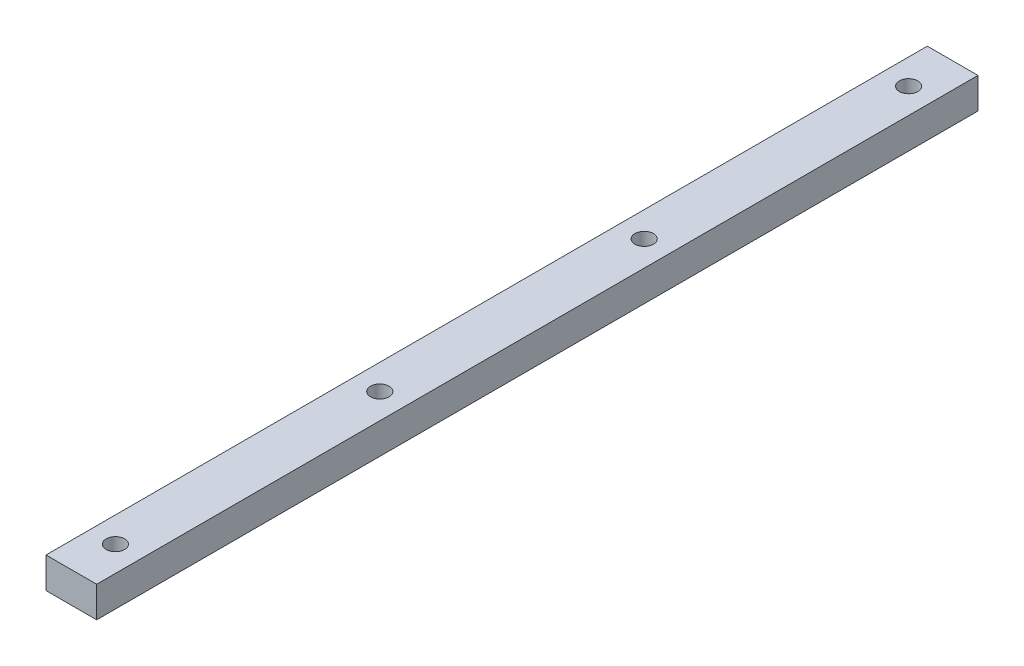
ISO-10303-21;
HEADER;
FILE_DESCRIPTION(('STEP AP214'),'2;1');
FILE_NAME('part.step','',(''),(''),'','','');
FILE_SCHEMA(('AUTOMOTIVE_DESIGN { 1 0 10303 214 1 1 1 1 }'));
ENDSEC;
DATA;
#1=APPLICATION_CONTEXT('core data for automotive mechanical design processes');
#2=APPLICATION_PROTOCOL_DEFINITION('international standard','automotive_design',2000,#1);
#3=PRODUCT_CONTEXT('',#1,'mechanical');
#4=PRODUCT('Part','Part','',(#3));
#5=PRODUCT_RELATED_PRODUCT_CATEGORY('part','',(#4));
#6=PRODUCT_DEFINITION_FORMATION('','',#4);
#7=PRODUCT_DEFINITION_CONTEXT('part definition',#1,'design');
#8=PRODUCT_DEFINITION('design','',#6,#7);
#9=PRODUCT_DEFINITION_SHAPE('','',#8);
#10=(LENGTH_UNIT() NAMED_UNIT(*) SI_UNIT(.MILLI.,.METRE.));
#11=(NAMED_UNIT(*) PLANE_ANGLE_UNIT() SI_UNIT($,.RADIAN.));
#12=(NAMED_UNIT(*) SI_UNIT($,.STERADIAN.) SOLID_ANGLE_UNIT());
#13=UNCERTAINTY_MEASURE_WITH_UNIT(LENGTH_MEASURE(1.E-05),#10,'distance_accuracy_value','');
#14=(GEOMETRIC_REPRESENTATION_CONTEXT(3) GLOBAL_UNCERTAINTY_ASSIGNED_CONTEXT((#13)) GLOBAL_UNIT_ASSIGNED_CONTEXT((#10,
#11,#12)) REPRESENTATION_CONTEXT('',''));
#15=CARTESIAN_POINT('',(0.,0.,0.));
#16=DIRECTION('',(0.,0.,1.));
#17=DIRECTION('',(1.,0.,0.));
#18=AXIS2_PLACEMENT_3D('',#15,#16,#17);
#19=CARTESIAN_POINT('',(5.75,-3.5,100.));
#20=DIRECTION('',(-1.,0.,0.));
#21=DIRECTION('',(0.,0.,1.));
#22=AXIS2_PLACEMENT_3D('',#19,#20,#21);
#23=PLANE('',#22);
#24=DIRECTION('',(0.,1.,0.));
#25=VECTOR('',#24,1.);
#26=CARTESIAN_POINT('',(5.75,-3.5,-100.));
#27=LINE('',#26,#25);
#28=CARTESIAN_POINT('',(5.75,-3.5,-100.));
#29=VERTEX_POINT('',#28);
#30=CARTESIAN_POINT('',(5.75,3.5,-100.));
#31=VERTEX_POINT('',#30);
#32=EDGE_CURVE('E97',#29,#31,#27,.T.);
#33=ORIENTED_EDGE('',*,*,#32,.T.);
#34=DIRECTION('',(0.,0.,-1.));
#35=VECTOR('',#34,1.);
#36=CARTESIAN_POINT('',(5.75,3.5,100.));
#37=LINE('',#36,#35);
#38=CARTESIAN_POINT('',(5.75,3.5,100.));
#39=VERTEX_POINT('',#38);
#40=EDGE_CURVE('E11',#39,#31,#37,.T.);
#41=ORIENTED_EDGE('',*,*,#40,.F.);
#42=DIRECTION('',(0.,1.,0.));
#43=VECTOR('',#42,1.);
#44=CARTESIAN_POINT('',(5.75,-3.5,100.));
#45=LINE('',#44,#43);
#46=CARTESIAN_POINT('',(5.75,-3.5,100.));
#47=VERTEX_POINT('',#46);
#48=EDGE_CURVE('E85',#47,#39,#45,.T.);
#49=ORIENTED_EDGE('',*,*,#48,.F.);
#50=DIRECTION('',(0.,0.,-1.));
#51=VECTOR('',#50,1.);
#52=CARTESIAN_POINT('',(5.75,-3.5,100.));
#53=LINE('',#52,#51);
#54=EDGE_CURVE('E93',#47,#29,#53,.T.);
#55=ORIENTED_EDGE('',*,*,#54,.T.);
#56=EDGE_LOOP('',(#33,#41,#49,#55));
#57=FACE_BOUND('',#56,.T.);
#58=ADVANCED_FACE('F34',(#57),#23,.F.);
#59=CARTESIAN_POINT('',(-5.75,3.5,100.));
#60=DIRECTION('',(0.,-1.,0.));
#61=DIRECTION('',(0.,0.,-1.));
#62=AXIS2_PLACEMENT_3D('',#59,#60,#61);
#63=PLANE('',#62);
#64=CARTESIAN_POINT('',(0.,3.5,-90.));
#65=DIRECTION('',(0.,1.,0.));
#66=DIRECTION('',(0.,0.,1.));
#67=AXIS2_PLACEMENT_3D('',#64,#65,#66);
#68=CIRCLE('',#67,2.1);
#69=CARTESIAN_POINT('',(0.,3.5,-87.9));
#70=VERTEX_POINT('',#69);
#71=EDGE_CURVE('E131',#70,#70,#68,.T.);
#72=ORIENTED_EDGE('',*,*,#71,.F.);
#73=EDGE_LOOP('',(#72));
#74=FACE_BOUND('',#73,.T.);
#75=CARTESIAN_POINT('',(6.24792700594322E-13,3.5,-30.));
#76=DIRECTION('',(0.,1.,0.));
#77=DIRECTION('',(0.,0.,1.));
#78=AXIS2_PLACEMENT_3D('',#75,#76,#77);
#79=CIRCLE('',#78,2.1);
#80=CARTESIAN_POINT('',(6.24792700594322E-13,3.5,-27.9));
#81=VERTEX_POINT('',#80);
#82=EDGE_CURVE('E125',#81,#81,#79,.T.);
#83=ORIENTED_EDGE('',*,*,#82,.F.);
#84=EDGE_LOOP('',(#83));
#85=FACE_BOUND('',#84,.T.);
#86=CARTESIAN_POINT('',(1.24958540118864E-12,3.5,30.));
#87=DIRECTION('',(0.,1.,0.));
#88=DIRECTION('',(0.,0.,1.));
#89=AXIS2_PLACEMENT_3D('',#86,#87,#88);
#90=CIRCLE('',#89,2.1);
#91=CARTESIAN_POINT('',(1.24958540118864E-12,3.5,32.1));
#92=VERTEX_POINT('',#91);
#93=EDGE_CURVE('E119',#92,#92,#90,.T.);
#94=ORIENTED_EDGE('',*,*,#93,.F.);
#95=EDGE_LOOP('',(#94));
#96=FACE_BOUND('',#95,.T.);
#97=CARTESIAN_POINT('',(1.87437810178297E-12,3.5,90.));
#98=DIRECTION('',(0.,1.,0.));
#99=DIRECTION('',(0.,0.,1.));
#100=AXIS2_PLACEMENT_3D('',#97,#98,#99);
#101=CIRCLE('',#100,2.1);
#102=CARTESIAN_POINT('',(1.87437810178297E-12,3.5,92.1));
#103=VERTEX_POINT('',#102);
#104=EDGE_CURVE('E113',#103,#103,#101,.T.);
#105=ORIENTED_EDGE('',*,*,#104,.F.);
#106=EDGE_LOOP('',(#105));
#107=FACE_BOUND('',#106,.T.);
#108=DIRECTION('',(-1.,0.,0.));
#109=VECTOR('',#108,1.);
#110=CARTESIAN_POINT('',(-5.75,3.5,-100.));
#111=LINE('',#110,#109);
#112=CARTESIAN_POINT('',(-5.75,3.5,-100.));
#113=VERTEX_POINT('',#112);
#114=EDGE_CURVE('E89',#31,#113,#111,.T.);
#115=ORIENTED_EDGE('',*,*,#114,.T.);
#116=DIRECTION('',(0.,0.,-1.));
#117=VECTOR('',#116,1.);
#118=CARTESIAN_POINT('',(-5.75,3.5,100.));
#119=LINE('',#118,#117);
#120=CARTESIAN_POINT('',(-5.75,3.5,100.));
#121=VERTEX_POINT('',#120);
#122=EDGE_CURVE('E42',#121,#113,#119,.T.);
#123=ORIENTED_EDGE('',*,*,#122,.F.);
#124=DIRECTION('',(-1.,0.,0.));
#125=VECTOR('',#124,1.);
#126=CARTESIAN_POINT('',(-5.75,3.5,100.));
#127=LINE('',#126,#125);
#128=EDGE_CURVE('E80',#39,#121,#127,.T.);
#129=ORIENTED_EDGE('',*,*,#128,.F.);
#130=ORIENTED_EDGE('',*,*,#40,.T.);
#131=EDGE_LOOP('',(#115,#123,#129,#130));
#132=FACE_BOUND('',#131,.T.);
#133=ADVANCED_FACE('F88',(#74,#85,#96,#107,#132),#63,.F.);
#134=CARTESIAN_POINT('',(-5.75,-3.5,100.));
#135=DIRECTION('',(1.,0.,0.));
#136=DIRECTION('',(0.,0.,-1.));
#137=AXIS2_PLACEMENT_3D('',#134,#135,#136);
#138=PLANE('',#137);
#139=DIRECTION('',(0.,-1.,0.));
#140=VECTOR('',#139,1.);
#141=CARTESIAN_POINT('',(-5.75,-3.5,-100.));
#142=LINE('',#141,#140);
#143=CARTESIAN_POINT('',(-5.75,-3.5,-100.));
#144=VERTEX_POINT('',#143);
#145=EDGE_CURVE('E67',#113,#144,#142,.T.);
#146=ORIENTED_EDGE('',*,*,#145,.T.);
#147=DIRECTION('',(0.,0.,-1.));
#148=VECTOR('',#147,1.);
#149=CARTESIAN_POINT('',(-5.75,-3.5,100.));
#150=LINE('',#149,#148);
#151=CARTESIAN_POINT('',(-5.75,-3.5,100.));
#152=VERTEX_POINT('',#151);
#153=EDGE_CURVE('E90',#152,#144,#150,.T.);
#154=ORIENTED_EDGE('',*,*,#153,.F.);
#155=DIRECTION('',(0.,-1.,0.));
#156=VECTOR('',#155,1.);
#157=CARTESIAN_POINT('',(-5.75,-3.5,100.));
#158=LINE('',#157,#156);
#159=EDGE_CURVE('E83',#121,#152,#158,.T.);
#160=ORIENTED_EDGE('',*,*,#159,.F.);
#161=ORIENTED_EDGE('',*,*,#122,.T.);
#162=EDGE_LOOP('',(#146,#154,#160,#161));
#163=FACE_BOUND('',#162,.T.);
#164=ADVANCED_FACE('F91',(#163),#138,.F.);
#165=CARTESIAN_POINT('',(-5.75,-3.5,100.));
#166=DIRECTION('',(0.,1.,0.));
#167=DIRECTION('',(0.,0.,1.));
#168=AXIS2_PLACEMENT_3D('',#165,#166,#167);
#169=PLANE('',#168);
#170=CARTESIAN_POINT('',(0.,-3.5,-90.));
#171=DIRECTION('',(0.,1.,0.));
#172=DIRECTION('',(0.,0.,1.));
#173=AXIS2_PLACEMENT_3D('',#170,#171,#172);
#174=CIRCLE('',#173,2.1);
#175=CARTESIAN_POINT('',(0.,-3.5,-87.9));
#176=VERTEX_POINT('',#175);
#177=EDGE_CURVE('E128',#176,#176,#174,.T.);
#178=ORIENTED_EDGE('',*,*,#177,.T.);
#179=EDGE_LOOP('',(#178));
#180=FACE_BOUND('',#179,.T.);
#181=CARTESIAN_POINT('',(6.24792700594322E-13,-3.5,-30.));
#182=DIRECTION('',(0.,1.,0.));
#183=DIRECTION('',(0.,0.,1.));
#184=AXIS2_PLACEMENT_3D('',#181,#182,#183);
#185=CIRCLE('',#184,2.1);
#186=CARTESIAN_POINT('',(6.24792700594322E-13,-3.5,-27.9));
#187=VERTEX_POINT('',#186);
#188=EDGE_CURVE('E122',#187,#187,#185,.T.);
#189=ORIENTED_EDGE('',*,*,#188,.T.);
#190=EDGE_LOOP('',(#189));
#191=FACE_BOUND('',#190,.T.);
#192=CARTESIAN_POINT('',(1.24958540118864E-12,-3.5,30.));
#193=DIRECTION('',(0.,1.,0.));
#194=DIRECTION('',(0.,0.,1.));
#195=AXIS2_PLACEMENT_3D('',#192,#193,#194);
#196=CIRCLE('',#195,2.1);
#197=CARTESIAN_POINT('',(1.24958540118864E-12,-3.5,32.1));
#198=VERTEX_POINT('',#197);
#199=EDGE_CURVE('E116',#198,#198,#196,.T.);
#200=ORIENTED_EDGE('',*,*,#199,.T.);
#201=EDGE_LOOP('',(#200));
#202=FACE_BOUND('',#201,.T.);
#203=CARTESIAN_POINT('',(1.87437810178297E-12,-3.5,90.));
#204=DIRECTION('',(0.,1.,0.));
#205=DIRECTION('',(0.,0.,1.));
#206=AXIS2_PLACEMENT_3D('',#203,#204,#205);
#207=CIRCLE('',#206,2.1);
#208=CARTESIAN_POINT('',(1.87437810178297E-12,-3.5,92.1));
#209=VERTEX_POINT('',#208);
#210=EDGE_CURVE('E100',#209,#209,#207,.T.);
#211=ORIENTED_EDGE('',*,*,#210,.T.);
#212=EDGE_LOOP('',(#211));
#213=FACE_BOUND('',#212,.T.);
#214=DIRECTION('',(1.,0.,0.));
#215=VECTOR('',#214,1.);
#216=CARTESIAN_POINT('',(-5.75,-3.5,-100.));
#217=LINE('',#216,#215);
#218=EDGE_CURVE('E73',#144,#29,#217,.T.);
#219=ORIENTED_EDGE('',*,*,#218,.T.);
#220=ORIENTED_EDGE('',*,*,#54,.F.);
#221=DIRECTION('',(1.,0.,0.));
#222=VECTOR('',#221,1.);
#223=CARTESIAN_POINT('',(-5.75,-3.5,100.));
#224=LINE('',#223,#222);
#225=EDGE_CURVE('E50',#152,#47,#224,.T.);
#226=ORIENTED_EDGE('',*,*,#225,.F.);
#227=ORIENTED_EDGE('',*,*,#153,.T.);
#228=EDGE_LOOP('',(#219,#220,#226,#227));
#229=FACE_BOUND('',#228,.T.);
#230=ADVANCED_FACE('F105',(#180,#191,#202,#213,#229),#169,.F.);
#231=CARTESIAN_POINT('',(0.,0.,100.));
#232=DIRECTION('',(0.,0.,-1.));
#233=DIRECTION('',(-1.,0.,0.));
#234=AXIS2_PLACEMENT_3D('',#231,#232,#233);
#235=PLANE('',#234);
#236=ORIENTED_EDGE('',*,*,#48,.T.);
#237=ORIENTED_EDGE('',*,*,#128,.T.);
#238=ORIENTED_EDGE('',*,*,#159,.T.);
#239=ORIENTED_EDGE('',*,*,#225,.T.);
#240=EDGE_LOOP('',(#236,#237,#238,#239));
#241=FACE_BOUND('',#240,.T.);
#242=ADVANCED_FACE('F81',(#241),#235,.F.);
#243=CARTESIAN_POINT('',(0.,0.,-100.));
#244=DIRECTION('',(0.,0.,-1.));
#245=DIRECTION('',(-1.,0.,0.));
#246=AXIS2_PLACEMENT_3D('',#243,#244,#245);
#247=PLANE('',#246);
#248=ORIENTED_EDGE('',*,*,#32,.F.);
#249=ORIENTED_EDGE('',*,*,#218,.F.);
#250=ORIENTED_EDGE('',*,*,#145,.F.);
#251=ORIENTED_EDGE('',*,*,#114,.F.);
#252=EDGE_LOOP('',(#248,#249,#250,#251));
#253=FACE_BOUND('',#252,.T.);
#254=ADVANCED_FACE('F108',(#253),#247,.T.);
#255=CARTESIAN_POINT('',(1.87437810178297E-12,3.5,90.));
#256=DIRECTION('',(0.,1.,0.));
#257=DIRECTION('',(0.,0.,1.));
#258=AXIS2_PLACEMENT_3D('',#255,#256,#257);
#259=CYLINDRICAL_SURFACE('',#258,2.1);
#260=ORIENTED_EDGE('',*,*,#210,.F.);
#261=EDGE_LOOP('',(#260));
#262=FACE_BOUND('',#261,.T.);
#263=ORIENTED_EDGE('',*,*,#104,.T.);
#264=EDGE_LOOP('',(#263));
#265=FACE_BOUND('',#264,.T.);
#266=ADVANCED_FACE('F145',(#262,#265),#259,.F.);
#267=CARTESIAN_POINT('',(1.24958540118864E-12,3.5,30.));
#268=DIRECTION('',(0.,1.,0.));
#269=DIRECTION('',(0.,0.,1.));
#270=AXIS2_PLACEMENT_3D('',#267,#268,#269);
#271=CYLINDRICAL_SURFACE('',#270,2.1);
#272=ORIENTED_EDGE('',*,*,#199,.F.);
#273=EDGE_LOOP('',(#272));
#274=FACE_BOUND('',#273,.T.);
#275=ORIENTED_EDGE('',*,*,#93,.T.);
#276=EDGE_LOOP('',(#275));
#277=FACE_BOUND('',#276,.T.);
#278=ADVANCED_FACE('F147',(#274,#277),#271,.F.);
#279=CARTESIAN_POINT('',(6.24792700594322E-13,3.5,-30.));
#280=DIRECTION('',(0.,1.,0.));
#281=DIRECTION('',(0.,0.,1.));
#282=AXIS2_PLACEMENT_3D('',#279,#280,#281);
#283=CYLINDRICAL_SURFACE('',#282,2.1);
#284=ORIENTED_EDGE('',*,*,#188,.F.);
#285=EDGE_LOOP('',(#284));
#286=FACE_BOUND('',#285,.T.);
#287=ORIENTED_EDGE('',*,*,#82,.T.);
#288=EDGE_LOOP('',(#287));
#289=FACE_BOUND('',#288,.T.);
#290=ADVANCED_FACE('F154',(#286,#289),#283,.F.);
#291=CARTESIAN_POINT('',(0.,3.5,-90.));
#292=DIRECTION('',(0.,1.,0.));
#293=DIRECTION('',(0.,0.,1.));
#294=AXIS2_PLACEMENT_3D('',#291,#292,#293);
#295=CYLINDRICAL_SURFACE('',#294,2.1);
#296=ORIENTED_EDGE('',*,*,#177,.F.);
#297=EDGE_LOOP('',(#296));
#298=FACE_BOUND('',#297,.T.);
#299=ORIENTED_EDGE('',*,*,#71,.T.);
#300=EDGE_LOOP('',(#299));
#301=FACE_BOUND('',#300,.T.);
#302=ADVANCED_FACE('F135',(#298,#301),#295,.F.);
#303=CLOSED_SHELL('',(#58,#133,#164,#230,#242,#254,#266,#278,#290,#302));
#304=MANIFOLD_SOLID_BREP('B2',#303);
#305=ADVANCED_BREP_SHAPE_REPRESENTATION('',(#18,#304),#14);
#306=SHAPE_DEFINITION_REPRESENTATION(#9,#305);
ENDSEC;
END-ISO-10303-21;
